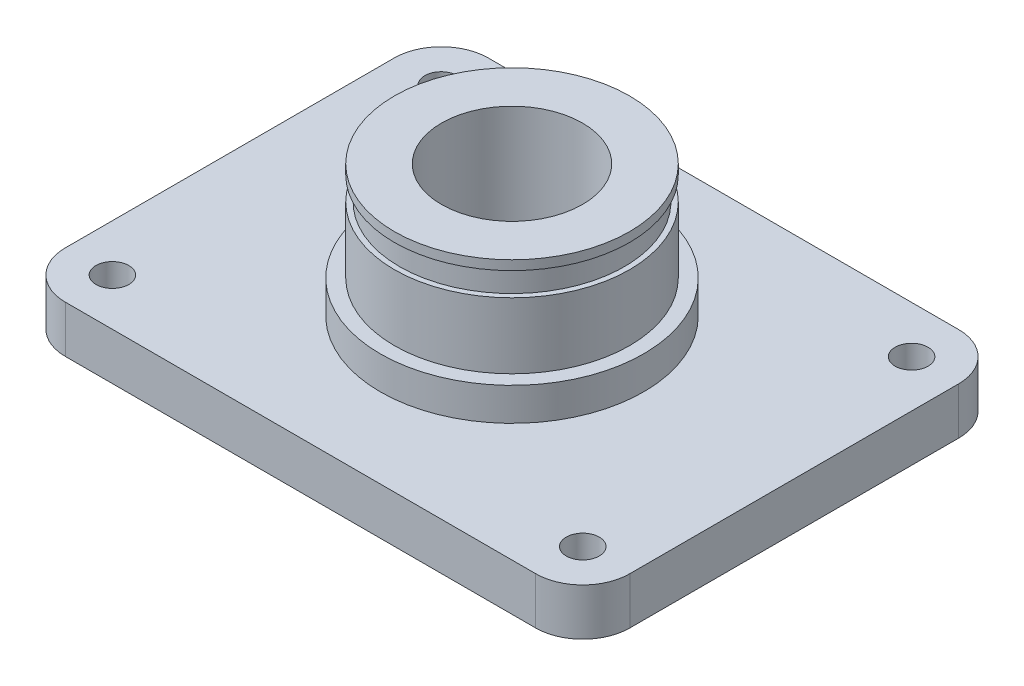
ISO-10303-21;
HEADER;
FILE_DESCRIPTION(('STEP AP214'),'2;1');
FILE_NAME('part.step','',(''),(''),'','','');
FILE_SCHEMA(('AUTOMOTIVE_DESIGN { 1 0 10303 214 1 1 1 1 }'));
ENDSEC;
DATA;
#1=APPLICATION_CONTEXT('core data for automotive mechanical design processes');
#2=APPLICATION_PROTOCOL_DEFINITION('international standard','automotive_design',2000,#1);
#3=PRODUCT_CONTEXT('',#1,'mechanical');
#4=PRODUCT('Part','Part','',(#3));
#5=PRODUCT_RELATED_PRODUCT_CATEGORY('part','',(#4));
#6=PRODUCT_DEFINITION_FORMATION('','',#4);
#7=PRODUCT_DEFINITION_CONTEXT('part definition',#1,'design');
#8=PRODUCT_DEFINITION('design','',#6,#7);
#9=PRODUCT_DEFINITION_SHAPE('','',#8);
#10=(LENGTH_UNIT() NAMED_UNIT(*) SI_UNIT(.MILLI.,.METRE.));
#11=(NAMED_UNIT(*) PLANE_ANGLE_UNIT() SI_UNIT($,.RADIAN.));
#12=(NAMED_UNIT(*) SI_UNIT($,.STERADIAN.) SOLID_ANGLE_UNIT());
#13=UNCERTAINTY_MEASURE_WITH_UNIT(LENGTH_MEASURE(1.E-05),#10,'distance_accuracy_value','');
#14=(GEOMETRIC_REPRESENTATION_CONTEXT(3) GLOBAL_UNCERTAINTY_ASSIGNED_CONTEXT((#13)) GLOBAL_UNIT_ASSIGNED_CONTEXT((#10,
#11,#12)) REPRESENTATION_CONTEXT('',''));
#15=CARTESIAN_POINT('',(0.,0.,0.));
#16=DIRECTION('',(0.,0.,1.));
#17=DIRECTION('',(1.,0.,0.));
#18=AXIS2_PLACEMENT_3D('',#15,#16,#17);
#19=CARTESIAN_POINT('',(0.,14.,0.));
#20=DIRECTION('',(0.,-1.,0.));
#21=DIRECTION('',(0.,0.,-1.));
#22=AXIS2_PLACEMENT_3D('',#19,#20,#21);
#23=CYLINDRICAL_SURFACE('',#22,12.5);
#24=CARTESIAN_POINT('',(0.,3.5,0.));
#25=DIRECTION('',(0.,1.,0.));
#26=DIRECTION('',(0.,0.,1.));
#27=AXIS2_PLACEMENT_3D('',#24,#25,#26);
#28=CIRCLE('',#27,12.5);
#29=CARTESIAN_POINT('',(0.,3.5,12.5));
#30=VERTEX_POINT('',#29);
#31=EDGE_CURVE('E160',#30,#30,#28,.T.);
#32=ORIENTED_EDGE('',*,*,#31,.T.);
#33=EDGE_LOOP('',(#32));
#34=FACE_BOUND('',#33,.T.);
#35=CARTESIAN_POINT('',(0.,10.5,0.));
#36=DIRECTION('',(0.,1.,0.));
#37=DIRECTION('',(0.,0.,1.));
#38=AXIS2_PLACEMENT_3D('',#35,#36,#37);
#39=CIRCLE('',#38,12.5);
#40=CARTESIAN_POINT('',(0.,10.5,12.5));
#41=VERTEX_POINT('',#40);
#42=EDGE_CURVE('E156',#41,#41,#39,.T.);
#43=ORIENTED_EDGE('',*,*,#42,.F.);
#44=EDGE_LOOP('',(#43));
#45=FACE_BOUND('',#44,.T.);
#46=ADVANCED_FACE('F33',(#34,#45),#23,.T.);
#47=CARTESIAN_POINT('',(0.,0.,0.));
#48=DIRECTION('',(0.,1.,0.));
#49=DIRECTION('',(0.,0.,1.));
#50=AXIS2_PLACEMENT_3D('',#47,#48,#49);
#51=PLANE('',#50);
#52=CARTESIAN_POINT('',(-25.,0.,17.4789664107582));
#53=DIRECTION('',(0.,1.,0.));
#54=DIRECTION('',(0.,0.,1.));
#55=AXIS2_PLACEMENT_3D('',#52,#53,#54);
#56=CIRCLE('',#55,1.75);
#57=CARTESIAN_POINT('',(-25.,0.,19.2289664107582));
#58=VERTEX_POINT('',#57);
#59=EDGE_CURVE('E369',#58,#58,#56,.T.);
#60=ORIENTED_EDGE('',*,*,#59,.F.);
#61=EDGE_LOOP('',(#60));
#62=FACE_BOUND('',#61,.T.);
#63=CARTESIAN_POINT('',(25.,0.,17.4789664107582));
#64=DIRECTION('',(0.,1.,0.));
#65=DIRECTION('',(0.,0.,1.));
#66=AXIS2_PLACEMENT_3D('',#63,#64,#65);
#67=CIRCLE('',#66,1.75);
#68=CARTESIAN_POINT('',(25.,0.,19.2289664107582));
#69=VERTEX_POINT('',#68);
#70=EDGE_CURVE('E370',#69,#69,#67,.T.);
#71=ORIENTED_EDGE('',*,*,#70,.F.);
#72=EDGE_LOOP('',(#71));
#73=FACE_BOUND('',#72,.T.);
#74=CARTESIAN_POINT('',(25.,0.,-17.4789664107582));
#75=DIRECTION('',(0.,1.,0.));
#76=DIRECTION('',(0.,0.,1.));
#77=AXIS2_PLACEMENT_3D('',#74,#75,#76);
#78=CIRCLE('',#77,1.75);
#79=CARTESIAN_POINT('',(25.,0.,-15.7289664107582));
#80=VERTEX_POINT('',#79);
#81=EDGE_CURVE('E372',#80,#80,#78,.T.);
#82=ORIENTED_EDGE('',*,*,#81,.F.);
#83=EDGE_LOOP('',(#82));
#84=FACE_BOUND('',#83,.T.);
#85=CARTESIAN_POINT('',(-25.,0.,-17.4789664107582));
#86=DIRECTION('',(0.,1.,0.));
#87=DIRECTION('',(0.,0.,1.));
#88=AXIS2_PLACEMENT_3D('',#85,#86,#87);
#89=CIRCLE('',#88,1.75);
#90=CARTESIAN_POINT('',(-25.,0.,-15.7289664107582));
#91=VERTEX_POINT('',#90);
#92=EDGE_CURVE('E165',#91,#91,#89,.T.);
#93=ORIENTED_EDGE('',*,*,#92,.F.);
#94=EDGE_LOOP('',(#93));
#95=FACE_BOUND('',#94,.T.);
#96=DIRECTION('',(0.,0.,1.));
#97=VECTOR('',#96,1.);
#98=CARTESIAN_POINT('',(30.,0.,-22.4789664107582));
#99=LINE('',#98,#97);
#100=CARTESIAN_POINT('',(30.,0.,-17.4789664107582));
#101=VERTEX_POINT('',#100);
#102=CARTESIAN_POINT('',(30.,0.,17.4789664107582));
#103=VERTEX_POINT('',#102);
#104=EDGE_CURVE('E197',#101,#103,#99,.T.);
#105=ORIENTED_EDGE('',*,*,#104,.F.);
#106=CARTESIAN_POINT('',(25.,0.,-17.4789664107582));
#107=DIRECTION('',(0.,1.,0.));
#108=DIRECTION('',(0.,0.,1.));
#109=AXIS2_PLACEMENT_3D('',#106,#107,#108);
#110=CIRCLE('',#109,5.);
#111=CARTESIAN_POINT('',(25.,0.,-22.4789664107582));
#112=VERTEX_POINT('',#111);
#113=EDGE_CURVE('E146',#101,#112,#110,.T.);
#114=ORIENTED_EDGE('',*,*,#113,.T.);
#115=DIRECTION('',(1.,0.,0.));
#116=VECTOR('',#115,1.);
#117=CARTESIAN_POINT('',(-30.,0.,-22.4789664107582));
#118=LINE('',#117,#116);
#119=CARTESIAN_POINT('',(-25.,0.,-22.4789664107582));
#120=VERTEX_POINT('',#119);
#121=EDGE_CURVE('E211',#120,#112,#118,.T.);
#122=ORIENTED_EDGE('',*,*,#121,.F.);
#123=CARTESIAN_POINT('',(-25.,0.,-17.4789664107582));
#124=DIRECTION('',(0.,1.,0.));
#125=DIRECTION('',(0.,0.,1.));
#126=AXIS2_PLACEMENT_3D('',#123,#124,#125);
#127=CIRCLE('',#126,5.);
#128=CARTESIAN_POINT('',(-30.,0.,-17.4789664107582));
#129=VERTEX_POINT('',#128);
#130=EDGE_CURVE('E126',#120,#129,#127,.T.);
#131=ORIENTED_EDGE('',*,*,#130,.T.);
#132=DIRECTION('',(0.,0.,-1.));
#133=VECTOR('',#132,1.);
#134=CARTESIAN_POINT('',(-30.,0.,-22.4789664107582));
#135=LINE('',#134,#133);
#136=CARTESIAN_POINT('',(-30.,0.,17.4789664107582));
#137=VERTEX_POINT('',#136);
#138=EDGE_CURVE('E208',#137,#129,#135,.T.);
#139=ORIENTED_EDGE('',*,*,#138,.F.);
#140=CARTESIAN_POINT('',(-25.,0.,17.4789664107582));
#141=DIRECTION('',(0.,1.,0.));
#142=DIRECTION('',(0.,0.,1.));
#143=AXIS2_PLACEMENT_3D('',#140,#141,#142);
#144=CIRCLE('',#143,5.);
#145=CARTESIAN_POINT('',(-25.,0.,22.4789664107582));
#146=VERTEX_POINT('',#145);
#147=EDGE_CURVE('E50',#137,#146,#144,.T.);
#148=ORIENTED_EDGE('',*,*,#147,.T.);
#149=DIRECTION('',(-1.,0.,0.));
#150=VECTOR('',#149,1.);
#151=CARTESIAN_POINT('',(-30.,0.,22.4789664107582));
#152=LINE('',#151,#150);
#153=CARTESIAN_POINT('',(25.,0.,22.4789664107582));
#154=VERTEX_POINT('',#153);
#155=EDGE_CURVE('E206',#154,#146,#152,.T.);
#156=ORIENTED_EDGE('',*,*,#155,.F.);
#157=CARTESIAN_POINT('',(25.,0.,17.4789664107582));
#158=DIRECTION('',(0.,1.,0.));
#159=DIRECTION('',(0.,0.,1.));
#160=AXIS2_PLACEMENT_3D('',#157,#158,#159);
#161=CIRCLE('',#160,5.);
#162=EDGE_CURVE('E144',#154,#103,#161,.T.);
#163=ORIENTED_EDGE('',*,*,#162,.T.);
#164=EDGE_LOOP('',(#105,#114,#122,#131,#139,#148,#156,#163));
#165=FACE_BOUND('',#164,.T.);
#166=CARTESIAN_POINT('',(0.,0.,0.));
#167=DIRECTION('',(0.,1.,0.));
#168=DIRECTION('',(0.,0.,1.));
#169=AXIS2_PLACEMENT_3D('',#166,#167,#168);
#170=CIRCLE('',#169,14.);
#171=CARTESIAN_POINT('',(0.,0.,14.));
#172=VERTEX_POINT('',#171);
#173=EDGE_CURVE('E189',#172,#172,#170,.T.);
#174=ORIENTED_EDGE('',*,*,#173,.F.);
#175=EDGE_LOOP('',(#174));
#176=FACE_BOUND('',#175,.T.);
#177=ADVANCED_FACE('F217',(#62,#73,#84,#95,#165,#176),#51,.T.);
#178=CARTESIAN_POINT('',(0.,14.,0.));
#179=DIRECTION('',(0.,1.,0.));
#180=DIRECTION('',(0.,0.,1.));
#181=AXIS2_PLACEMENT_3D('',#178,#179,#180);
#182=PLANE('',#181);
#183=CARTESIAN_POINT('',(0.,14.,0.));
#184=DIRECTION('',(0.,1.,0.));
#185=DIRECTION('',(0.,0.,1.));
#186=AXIS2_PLACEMENT_3D('',#183,#184,#185);
#187=CIRCLE('',#186,12.5);
#188=CARTESIAN_POINT('',(0.,14.,12.5));
#189=VERTEX_POINT('',#188);
#190=EDGE_CURVE('E122',#189,#189,#187,.T.);
#191=ORIENTED_EDGE('',*,*,#190,.T.);
#192=EDGE_LOOP('',(#191));
#193=FACE_BOUND('',#192,.T.);
#194=CARTESIAN_POINT('',(0.,14.,0.));
#195=DIRECTION('',(0.,1.,0.));
#196=DIRECTION('',(0.,0.,1.));
#197=AXIS2_PLACEMENT_3D('',#194,#195,#196);
#198=CIRCLE('',#197,7.49999999999999);
#199=CARTESIAN_POINT('',(0.,14.,7.49999999999999));
#200=VERTEX_POINT('',#199);
#201=EDGE_CURVE('E172',#200,#200,#198,.T.);
#202=ORIENTED_EDGE('',*,*,#201,.F.);
#203=EDGE_LOOP('',(#202));
#204=FACE_BOUND('',#203,.T.);
#205=ADVANCED_FACE('F251',(#193,#204),#182,.T.);
#206=CARTESIAN_POINT('',(0.,13.,0.));
#207=DIRECTION('',(0.,1.,0.));
#208=DIRECTION('',(0.,0.,1.));
#209=AXIS2_PLACEMENT_3D('',#206,#207,#208);
#210=CIRCLE('',#209,12.5);
#211=CARTESIAN_POINT('',(0.,13.,12.5));
#212=VERTEX_POINT('',#211);
#213=EDGE_CURVE('E153',#212,#212,#210,.T.);
#214=ORIENTED_EDGE('',*,*,#213,.T.);
#215=EDGE_LOOP('',(#214));
#216=FACE_BOUND('',#215,.T.);
#217=ORIENTED_EDGE('',*,*,#190,.F.);
#218=EDGE_LOOP('',(#217));
#219=FACE_BOUND('',#218,.T.);
#220=ADVANCED_FACE('F245',(#216,#219),#23,.T.);
#221=CARTESIAN_POINT('',(-30.,74.9747672459474,-22.4789664107582));
#222=DIRECTION('',(-1.,0.,0.));
#223=DIRECTION('',(0.,0.,1.));
#224=AXIS2_PLACEMENT_3D('',#221,#222,#223);
#225=PLANE('',#224);
#226=ORIENTED_EDGE('',*,*,#138,.T.);
#227=DIRECTION('',(0.,-1.,0.));
#228=VECTOR('',#227,1.);
#229=CARTESIAN_POINT('',(-30.,74.9747672459474,-17.4789664107582));
#230=LINE('',#229,#228);
#231=CARTESIAN_POINT('',(-30.,-5.,-17.4789664107582));
#232=VERTEX_POINT('',#231);
#233=EDGE_CURVE('E11',#129,#232,#230,.T.);
#234=ORIENTED_EDGE('',*,*,#233,.T.);
#235=DIRECTION('',(0.,0.,-1.));
#236=VECTOR('',#235,1.);
#237=CARTESIAN_POINT('',(-30.,-5.,-22.4789664107582));
#238=LINE('',#237,#236);
#239=CARTESIAN_POINT('',(-30.,-5.,17.4789664107582));
#240=VERTEX_POINT('',#239);
#241=EDGE_CURVE('E107',#240,#232,#238,.T.);
#242=ORIENTED_EDGE('',*,*,#241,.F.);
#243=DIRECTION('',(0.,-1.,0.));
#244=VECTOR('',#243,1.);
#245=CARTESIAN_POINT('',(-30.,74.9747672459474,17.4789664107582));
#246=LINE('',#245,#244);
#247=EDGE_CURVE('E42',#240,#137,#246,.F.);
#248=ORIENTED_EDGE('',*,*,#247,.T.);
#249=EDGE_LOOP('',(#226,#234,#242,#248));
#250=FACE_BOUND('',#249,.T.);
#251=ADVANCED_FACE('F214',(#250),#225,.T.);
#252=CARTESIAN_POINT('',(30.,74.9747672459474,-22.4789664107582));
#253=DIRECTION('',(1.,0.,0.));
#254=DIRECTION('',(0.,0.,-1.));
#255=AXIS2_PLACEMENT_3D('',#252,#253,#254);
#256=PLANE('',#255);
#257=DIRECTION('',(0.,0.,1.));
#258=VECTOR('',#257,1.);
#259=CARTESIAN_POINT('',(30.,-5.,-22.4789664107582));
#260=LINE('',#259,#258);
#261=CARTESIAN_POINT('',(30.,-5.,-17.4789664107582));
#262=VERTEX_POINT('',#261);
#263=CARTESIAN_POINT('',(30.,-5.,17.4789664107582));
#264=VERTEX_POINT('',#263);
#265=EDGE_CURVE('E203',#262,#264,#260,.T.);
#266=ORIENTED_EDGE('',*,*,#265,.F.);
#267=DIRECTION('',(0.,-1.,0.));
#268=VECTOR('',#267,1.);
#269=CARTESIAN_POINT('',(30.,74.9747672459474,-17.4789664107582));
#270=LINE('',#269,#268);
#271=EDGE_CURVE('E140',#262,#101,#270,.F.);
#272=ORIENTED_EDGE('',*,*,#271,.T.);
#273=ORIENTED_EDGE('',*,*,#104,.T.);
#274=DIRECTION('',(0.,-1.,0.));
#275=VECTOR('',#274,1.);
#276=CARTESIAN_POINT('',(30.,74.9747672459474,17.4789664107582));
#277=LINE('',#276,#275);
#278=EDGE_CURVE('E137',#103,#264,#277,.T.);
#279=ORIENTED_EDGE('',*,*,#278,.T.);
#280=EDGE_LOOP('',(#266,#272,#273,#279));
#281=FACE_BOUND('',#280,.T.);
#282=ADVANCED_FACE('F228',(#281),#256,.T.);
#283=CARTESIAN_POINT('',(-30.,74.9747672459474,-22.4789664107582));
#284=DIRECTION('',(0.,0.,-1.));
#285=DIRECTION('',(-1.,0.,0.));
#286=AXIS2_PLACEMENT_3D('',#283,#284,#285);
#287=PLANE('',#286);
#288=ORIENTED_EDGE('',*,*,#121,.T.);
#289=DIRECTION('',(0.,-1.,0.));
#290=VECTOR('',#289,1.);
#291=CARTESIAN_POINT('',(25.,74.9747672459474,-22.4789664107582));
#292=LINE('',#291,#290);
#293=CARTESIAN_POINT('',(25.,-5.,-22.4789664107582));
#294=VERTEX_POINT('',#293);
#295=EDGE_CURVE('E121',#112,#294,#292,.T.);
#296=ORIENTED_EDGE('',*,*,#295,.T.);
#297=DIRECTION('',(1.,0.,0.));
#298=VECTOR('',#297,1.);
#299=CARTESIAN_POINT('',(-30.,-5.,-22.4789664107582));
#300=LINE('',#299,#298);
#301=CARTESIAN_POINT('',(-25.,-5.,-22.4789664107582));
#302=VERTEX_POINT('',#301);
#303=EDGE_CURVE('E105',#302,#294,#300,.T.);
#304=ORIENTED_EDGE('',*,*,#303,.F.);
#305=DIRECTION('',(0.,-1.,0.));
#306=VECTOR('',#305,1.);
#307=CARTESIAN_POINT('',(-25.,74.9747672459474,-22.4789664107582));
#308=LINE('',#307,#306);
#309=EDGE_CURVE('E118',#302,#120,#308,.F.);
#310=ORIENTED_EDGE('',*,*,#309,.T.);
#311=EDGE_LOOP('',(#288,#296,#304,#310));
#312=FACE_BOUND('',#311,.T.);
#313=ADVANCED_FACE('F117',(#312),#287,.T.);
#314=CARTESIAN_POINT('',(-30.,74.9747672459474,22.4789664107582));
#315=DIRECTION('',(0.,0.,1.));
#316=DIRECTION('',(1.,0.,0.));
#317=AXIS2_PLACEMENT_3D('',#314,#315,#316);
#318=PLANE('',#317);
#319=DIRECTION('',(-1.,0.,0.));
#320=VECTOR('',#319,1.);
#321=CARTESIAN_POINT('',(-30.,-5.,22.4789664107582));
#322=LINE('',#321,#320);
#323=CARTESIAN_POINT('',(25.,-5.,22.4789664107582));
#324=VERTEX_POINT('',#323);
#325=CARTESIAN_POINT('',(-25.,-5.,22.4789664107582));
#326=VERTEX_POINT('',#325);
#327=EDGE_CURVE('E200',#324,#326,#322,.T.);
#328=ORIENTED_EDGE('',*,*,#327,.F.);
#329=DIRECTION('',(0.,-1.,0.));
#330=VECTOR('',#329,1.);
#331=CARTESIAN_POINT('',(25.,74.9747672459474,22.4789664107582));
#332=LINE('',#331,#330);
#333=EDGE_CURVE('E57',#324,#154,#332,.F.);
#334=ORIENTED_EDGE('',*,*,#333,.T.);
#335=ORIENTED_EDGE('',*,*,#155,.T.);
#336=DIRECTION('',(0.,-1.,0.));
#337=VECTOR('',#336,1.);
#338=CARTESIAN_POINT('',(-25.,74.9747672459474,22.4789664107582));
#339=LINE('',#338,#337);
#340=EDGE_CURVE('E148',#146,#326,#339,.T.);
#341=ORIENTED_EDGE('',*,*,#340,.T.);
#342=EDGE_LOOP('',(#328,#334,#335,#341));
#343=FACE_BOUND('',#342,.T.);
#344=ADVANCED_FACE('F221',(#343),#318,.T.);
#345=CARTESIAN_POINT('',(0.,-5.,0.));
#346=DIRECTION('',(0.,1.,0.));
#347=DIRECTION('',(0.,0.,1.));
#348=AXIS2_PLACEMENT_3D('',#345,#346,#347);
#349=PLANE('',#348);
#350=CARTESIAN_POINT('',(-25.,-5.,17.4789664107582));
#351=DIRECTION('',(0.,1.,0.));
#352=DIRECTION('',(0.,0.,1.));
#353=AXIS2_PLACEMENT_3D('',#350,#351,#352);
#354=CIRCLE('',#353,1.75);
#355=CARTESIAN_POINT('',(-25.,-5.,19.2289664107582));
#356=VERTEX_POINT('',#355);
#357=EDGE_CURVE('E37',#356,#356,#354,.T.);
#358=ORIENTED_EDGE('',*,*,#357,.T.);
#359=EDGE_LOOP('',(#358));
#360=FACE_BOUND('',#359,.T.);
#361=CARTESIAN_POINT('',(25.,-5.,17.4789664107582));
#362=DIRECTION('',(0.,1.,0.));
#363=DIRECTION('',(0.,0.,1.));
#364=AXIS2_PLACEMENT_3D('',#361,#362,#363);
#365=CIRCLE('',#364,1.75);
#366=CARTESIAN_POINT('',(25.,-5.,19.2289664107582));
#367=VERTEX_POINT('',#366);
#368=EDGE_CURVE('E167',#367,#367,#365,.T.);
#369=ORIENTED_EDGE('',*,*,#368,.T.);
#370=EDGE_LOOP('',(#369));
#371=FACE_BOUND('',#370,.T.);
#372=CARTESIAN_POINT('',(25.,-5.,-17.4789664107582));
#373=DIRECTION('',(0.,1.,0.));
#374=DIRECTION('',(0.,0.,1.));
#375=AXIS2_PLACEMENT_3D('',#372,#373,#374);
#376=CIRCLE('',#375,1.75);
#377=CARTESIAN_POINT('',(25.,-5.,-15.7289664107582));
#378=VERTEX_POINT('',#377);
#379=EDGE_CURVE('E164',#378,#378,#376,.T.);
#380=ORIENTED_EDGE('',*,*,#379,.T.);
#381=EDGE_LOOP('',(#380));
#382=FACE_BOUND('',#381,.T.);
#383=CARTESIAN_POINT('',(-25.,-5.,-17.4789664107582));
#384=DIRECTION('',(0.,1.,0.));
#385=DIRECTION('',(0.,0.,1.));
#386=AXIS2_PLACEMENT_3D('',#383,#384,#385);
#387=CIRCLE('',#386,1.75);
#388=CARTESIAN_POINT('',(-25.,-5.,-15.7289664107582));
#389=VERTEX_POINT('',#388);
#390=EDGE_CURVE('E161',#389,#389,#387,.T.);
#391=ORIENTED_EDGE('',*,*,#390,.T.);
#392=EDGE_LOOP('',(#391));
#393=FACE_BOUND('',#392,.T.);
#394=CARTESIAN_POINT('',(0.,-5.,0.));
#395=DIRECTION('',(0.,-1.,0.));
#396=DIRECTION('',(0.,0.,-1.));
#397=AXIS2_PLACEMENT_3D('',#394,#395,#396);
#398=CIRCLE('',#397,7.5);
#399=CARTESIAN_POINT('',(0.,-5.,-7.49999999999999));
#400=VERTEX_POINT('',#399);
#401=EDGE_CURVE('E193',#400,#400,#398,.T.);
#402=ORIENTED_EDGE('',*,*,#401,.F.);
#403=EDGE_LOOP('',(#402));
#404=FACE_BOUND('',#403,.T.);
#405=ORIENTED_EDGE('',*,*,#303,.T.);
#406=CARTESIAN_POINT('',(25.,-5.,-17.4789664107582));
#407=DIRECTION('',(0.,1.,0.));
#408=DIRECTION('',(0.,0.,1.));
#409=AXIS2_PLACEMENT_3D('',#406,#407,#408);
#410=CIRCLE('',#409,5.);
#411=EDGE_CURVE('E135',#294,#262,#410,.F.);
#412=ORIENTED_EDGE('',*,*,#411,.T.);
#413=ORIENTED_EDGE('',*,*,#265,.T.);
#414=CARTESIAN_POINT('',(25.,-5.,17.4789664107582));
#415=DIRECTION('',(0.,1.,0.));
#416=DIRECTION('',(0.,0.,1.));
#417=AXIS2_PLACEMENT_3D('',#414,#415,#416);
#418=CIRCLE('',#417,5.);
#419=EDGE_CURVE('E111',#264,#324,#418,.F.);
#420=ORIENTED_EDGE('',*,*,#419,.T.);
#421=ORIENTED_EDGE('',*,*,#327,.T.);
#422=CARTESIAN_POINT('',(-25.,-5.,17.4789664107582));
#423=DIRECTION('',(0.,1.,0.));
#424=DIRECTION('',(0.,0.,1.));
#425=AXIS2_PLACEMENT_3D('',#422,#423,#424);
#426=CIRCLE('',#425,5.);
#427=EDGE_CURVE('E112',#326,#240,#426,.F.);
#428=ORIENTED_EDGE('',*,*,#427,.T.);
#429=ORIENTED_EDGE('',*,*,#241,.T.);
#430=CARTESIAN_POINT('',(-25.,-5.,-17.4789664107582));
#431=DIRECTION('',(0.,1.,0.));
#432=DIRECTION('',(0.,0.,1.));
#433=AXIS2_PLACEMENT_3D('',#430,#431,#432);
#434=CIRCLE('',#433,5.);
#435=EDGE_CURVE('E102',#232,#302,#434,.F.);
#436=ORIENTED_EDGE('',*,*,#435,.T.);
#437=EDGE_LOOP('',(#405,#412,#413,#420,#421,#428,#429,#436));
#438=FACE_BOUND('',#437,.T.);
#439=ADVANCED_FACE('F104',(#360,#371,#382,#393,#404,#438),#349,.F.);
#440=CARTESIAN_POINT('',(25.,74.9747672459474,-17.4789664107582));
#441=DIRECTION('',(0.,-1.,0.));
#442=DIRECTION('',(0.,0.,-1.));
#443=AXIS2_PLACEMENT_3D('',#440,#441,#442);
#444=CYLINDRICAL_SURFACE('',#443,5.);
#445=ORIENTED_EDGE('',*,*,#113,.F.);
#446=ORIENTED_EDGE('',*,*,#271,.F.);
#447=ORIENTED_EDGE('',*,*,#411,.F.);
#448=ORIENTED_EDGE('',*,*,#295,.F.);
#449=EDGE_LOOP('',(#445,#446,#447,#448));
#450=FACE_BOUND('',#449,.T.);
#451=ADVANCED_FACE('F232',(#450),#444,.T.);
#452=CARTESIAN_POINT('',(25.,74.9747672459474,17.4789664107582));
#453=DIRECTION('',(0.,-1.,0.));
#454=DIRECTION('',(0.,0.,-1.));
#455=AXIS2_PLACEMENT_3D('',#452,#453,#454);
#456=CYLINDRICAL_SURFACE('',#455,5.);
#457=ORIENTED_EDGE('',*,*,#162,.F.);
#458=ORIENTED_EDGE('',*,*,#333,.F.);
#459=ORIENTED_EDGE('',*,*,#419,.F.);
#460=ORIENTED_EDGE('',*,*,#278,.F.);
#461=EDGE_LOOP('',(#457,#458,#459,#460));
#462=FACE_BOUND('',#461,.T.);
#463=ADVANCED_FACE('F226',(#462),#456,.T.);
#464=CARTESIAN_POINT('',(-25.,74.9747672459474,-17.4789664107582));
#465=DIRECTION('',(0.,-1.,0.));
#466=DIRECTION('',(0.,0.,-1.));
#467=AXIS2_PLACEMENT_3D('',#464,#465,#466);
#468=CYLINDRICAL_SURFACE('',#467,5.);
#469=ORIENTED_EDGE('',*,*,#130,.F.);
#470=ORIENTED_EDGE('',*,*,#309,.F.);
#471=ORIENTED_EDGE('',*,*,#435,.F.);
#472=ORIENTED_EDGE('',*,*,#233,.F.);
#473=EDGE_LOOP('',(#469,#470,#471,#472));
#474=FACE_BOUND('',#473,.T.);
#475=ADVANCED_FACE('F125',(#474),#468,.T.);
#476=CARTESIAN_POINT('',(-25.,74.9747672459474,17.4789664107582));
#477=DIRECTION('',(0.,-1.,0.));
#478=DIRECTION('',(0.,0.,-1.));
#479=AXIS2_PLACEMENT_3D('',#476,#477,#478);
#480=CYLINDRICAL_SURFACE('',#479,5.);
#481=ORIENTED_EDGE('',*,*,#147,.F.);
#482=ORIENTED_EDGE('',*,*,#247,.F.);
#483=ORIENTED_EDGE('',*,*,#427,.F.);
#484=ORIENTED_EDGE('',*,*,#340,.F.);
#485=EDGE_LOOP('',(#481,#482,#483,#484));
#486=FACE_BOUND('',#485,.T.);
#487=ADVANCED_FACE('F35',(#486),#480,.T.);
#488=CARTESIAN_POINT('',(0.,5.43572121597424,0.));
#489=DIRECTION('',(0.,-1.,0.));
#490=DIRECTION('',(0.,0.,-1.));
#491=AXIS2_PLACEMENT_3D('',#488,#489,#490);
#492=CYLINDRICAL_SURFACE('',#491,7.5);
#493=ORIENTED_EDGE('',*,*,#401,.T.);
#494=EDGE_LOOP('',(#493));
#495=FACE_BOUND('',#494,.T.);
#496=ORIENTED_EDGE('',*,*,#201,.T.);
#497=EDGE_LOOP('',(#496));
#498=FACE_BOUND('',#497,.T.);
#499=ADVANCED_FACE('F289',(#495,#498),#492,.F.);
#500=CARTESIAN_POINT('',(0.,3.5,0.));
#501=DIRECTION('',(0.,1.,0.));
#502=DIRECTION('',(0.,0.,1.));
#503=AXIS2_PLACEMENT_3D('',#500,#501,#502);
#504=PLANE('',#503);
#505=CARTESIAN_POINT('',(0.,3.5,0.));
#506=DIRECTION('',(0.,1.,0.));
#507=DIRECTION('',(0.,0.,1.));
#508=AXIS2_PLACEMENT_3D('',#505,#506,#507);
#509=CIRCLE('',#508,14.);
#510=CARTESIAN_POINT('',(0.,3.5,14.));
#511=VERTEX_POINT('',#510);
#512=EDGE_CURVE('E190',#511,#511,#509,.T.);
#513=ORIENTED_EDGE('',*,*,#512,.T.);
#514=EDGE_LOOP('',(#513));
#515=FACE_BOUND('',#514,.T.);
#516=ORIENTED_EDGE('',*,*,#31,.F.);
#517=EDGE_LOOP('',(#516));
#518=FACE_BOUND('',#517,.T.);
#519=ADVANCED_FACE('F286',(#515,#518),#504,.T.);
#520=CARTESIAN_POINT('',(0.,3.5,0.));
#521=DIRECTION('',(0.,-1.,0.));
#522=DIRECTION('',(0.,0.,-1.));
#523=AXIS2_PLACEMENT_3D('',#520,#521,#522);
#524=CYLINDRICAL_SURFACE('',#523,14.);
#525=ORIENTED_EDGE('',*,*,#512,.F.);
#526=EDGE_LOOP('',(#525));
#527=FACE_BOUND('',#526,.T.);
#528=ORIENTED_EDGE('',*,*,#173,.T.);
#529=EDGE_LOOP('',(#528));
#530=FACE_BOUND('',#529,.T.);
#531=ADVANCED_FACE('F282',(#527,#530),#524,.T.);
#532=CARTESIAN_POINT('',(0.,10.5,0.));
#533=DIRECTION('',(0.,1.,0.));
#534=DIRECTION('',(0.,0.,1.));
#535=AXIS2_PLACEMENT_3D('',#532,#533,#534);
#536=PLANE('',#535);
#537=CARTESIAN_POINT('',(0.,10.5,0.));
#538=DIRECTION('',(0.,1.,0.));
#539=DIRECTION('',(0.,0.,1.));
#540=AXIS2_PLACEMENT_3D('',#537,#538,#539);
#541=CIRCLE('',#540,11.95);
#542=CARTESIAN_POINT('',(0.,10.5,11.95));
#543=VERTEX_POINT('',#542);
#544=EDGE_CURVE('E157',#543,#543,#541,.T.);
#545=ORIENTED_EDGE('',*,*,#544,.F.);
#546=EDGE_LOOP('',(#545));
#547=FACE_BOUND('',#546,.T.);
#548=ORIENTED_EDGE('',*,*,#42,.T.);
#549=EDGE_LOOP('',(#548));
#550=FACE_BOUND('',#549,.T.);
#551=ADVANCED_FACE('F272',(#547,#550),#536,.T.);
#552=CARTESIAN_POINT('',(0.,13.,0.));
#553=DIRECTION('',(0.,1.,0.));
#554=DIRECTION('',(0.,0.,1.));
#555=AXIS2_PLACEMENT_3D('',#552,#553,#554);
#556=PLANE('',#555);
#557=CARTESIAN_POINT('',(0.,13.,0.));
#558=DIRECTION('',(0.,1.,0.));
#559=DIRECTION('',(0.,0.,1.));
#560=AXIS2_PLACEMENT_3D('',#557,#558,#559);
#561=CIRCLE('',#560,11.95);
#562=CARTESIAN_POINT('',(0.,13.,11.95));
#563=VERTEX_POINT('',#562);
#564=EDGE_CURVE('E176',#563,#563,#561,.T.);
#565=ORIENTED_EDGE('',*,*,#564,.T.);
#566=EDGE_LOOP('',(#565));
#567=FACE_BOUND('',#566,.T.);
#568=ORIENTED_EDGE('',*,*,#213,.F.);
#569=EDGE_LOOP('',(#568));
#570=FACE_BOUND('',#569,.T.);
#571=ADVANCED_FACE('F269',(#567,#570),#556,.F.);
#572=CARTESIAN_POINT('',(0.,10.5,0.));
#573=DIRECTION('',(0.,1.,0.));
#574=DIRECTION('',(0.,0.,1.));
#575=AXIS2_PLACEMENT_3D('',#572,#573,#574);
#576=CYLINDRICAL_SURFACE('',#575,11.95);
#577=ORIENTED_EDGE('',*,*,#544,.T.);
#578=EDGE_LOOP('',(#577));
#579=FACE_BOUND('',#578,.T.);
#580=ORIENTED_EDGE('',*,*,#564,.F.);
#581=EDGE_LOOP('',(#580));
#582=FACE_BOUND('',#581,.T.);
#583=ADVANCED_FACE('F271',(#579,#582),#576,.T.);
#584=CARTESIAN_POINT('',(-25.,-6.2,-17.4789664107582));
#585=DIRECTION('',(0.,1.,0.));
#586=DIRECTION('',(0.,0.,1.));
#587=AXIS2_PLACEMENT_3D('',#584,#585,#586);
#588=CYLINDRICAL_SURFACE('',#587,1.75);
#589=CARTESIAN_POINT('',(-25.,0.,-15.7289664107582));
#590=CARTESIAN_POINT('',(-25.,-0.0520833333333334,-15.7289664107582));
#591=CARTESIAN_POINT('',(-25.,-0.104166666666667,-15.7289664107582));
#592=CARTESIAN_POINT('',(-25.,-0.208333333333334,-15.7289664107582));
#593=CARTESIAN_POINT('',(-25.,-0.260416666666667,-15.7289664107582));
#594=CARTESIAN_POINT('',(-25.,-0.364583333333334,-15.7289664107582));
#595=CARTESIAN_POINT('',(-25.,-0.416666666666667,-15.7289664107582));
#596=CARTESIAN_POINT('',(-25.,-0.520833333333334,-15.7289664107582));
#597=CARTESIAN_POINT('',(-25.,-0.572916666666667,-15.7289664107582));
#598=CARTESIAN_POINT('',(-25.,-0.677083333333334,-15.7289664107582));
#599=CARTESIAN_POINT('',(-25.,-0.729166666666667,-15.7289664107582));
#600=CARTESIAN_POINT('',(-25.,-0.833333333333333,-15.7289664107582));
#601=CARTESIAN_POINT('',(-25.,-0.885416666666667,-15.7289664107582));
#602=CARTESIAN_POINT('',(-25.,-0.989583333333333,-15.7289664107582));
#603=CARTESIAN_POINT('',(-25.,-1.04166666666667,-15.7289664107582));
#604=CARTESIAN_POINT('',(-25.,-1.14583333333333,-15.7289664107582));
#605=CARTESIAN_POINT('',(-25.,-1.19791666666667,-15.7289664107582));
#606=CARTESIAN_POINT('',(-25.,-1.30208333333333,-15.7289664107582));
#607=CARTESIAN_POINT('',(-25.,-1.35416666666667,-15.7289664107582));
#608=CARTESIAN_POINT('',(-25.,-1.45833333333333,-15.7289664107582));
#609=CARTESIAN_POINT('',(-25.,-1.51041666666667,-15.7289664107582));
#610=CARTESIAN_POINT('',(-25.,-1.61458333333333,-15.7289664107582));
#611=CARTESIAN_POINT('',(-25.,-1.66666666666667,-15.7289664107582));
#612=CARTESIAN_POINT('',(-25.,-1.77083333333333,-15.7289664107582));
#613=CARTESIAN_POINT('',(-25.,-1.82291666666667,-15.7289664107582));
#614=CARTESIAN_POINT('',(-25.,-1.92708333333333,-15.7289664107582));
#615=CARTESIAN_POINT('',(-25.,-1.97916666666667,-15.7289664107582));
#616=CARTESIAN_POINT('',(-25.,-2.08333333333333,-15.7289664107582));
#617=CARTESIAN_POINT('',(-25.,-2.13541666666667,-15.7289664107582));
#618=CARTESIAN_POINT('',(-25.,-2.23958333333333,-15.7289664107582));
#619=CARTESIAN_POINT('',(-25.,-2.29166666666667,-15.7289664107582));
#620=CARTESIAN_POINT('',(-25.,-2.39583333333333,-15.7289664107582));
#621=CARTESIAN_POINT('',(-25.,-2.44791666666667,-15.7289664107582));
#622=CARTESIAN_POINT('',(-25.,-2.55208333333333,-15.7289664107582));
#623=CARTESIAN_POINT('',(-25.,-2.60416666666667,-15.7289664107582));
#624=CARTESIAN_POINT('',(-25.,-2.70833333333333,-15.7289664107582));
#625=CARTESIAN_POINT('',(-25.,-2.76041666666667,-15.7289664107582));
#626=CARTESIAN_POINT('',(-25.,-2.86458333333333,-15.7289664107582));
#627=CARTESIAN_POINT('',(-25.,-2.91666666666667,-15.7289664107582));
#628=CARTESIAN_POINT('',(-25.,-3.02083333333333,-15.7289664107582));
#629=CARTESIAN_POINT('',(-25.,-3.07291666666667,-15.7289664107582));
#630=CARTESIAN_POINT('',(-25.,-3.17708333333333,-15.7289664107582));
#631=CARTESIAN_POINT('',(-25.,-3.22916666666667,-15.7289664107582));
#632=CARTESIAN_POINT('',(-25.,-3.33333333333333,-15.7289664107582));
#633=CARTESIAN_POINT('',(-25.,-3.38541666666667,-15.7289664107582));
#634=CARTESIAN_POINT('',(-25.,-3.48958333333333,-15.7289664107582));
#635=CARTESIAN_POINT('',(-25.,-3.54166666666667,-15.7289664107582));
#636=CARTESIAN_POINT('',(-25.,-3.64583333333333,-15.7289664107582));
#637=CARTESIAN_POINT('',(-25.,-3.69791666666667,-15.7289664107582));
#638=CARTESIAN_POINT('',(-25.,-3.80208333333333,-15.7289664107582));
#639=CARTESIAN_POINT('',(-25.,-3.85416666666667,-15.7289664107582));
#640=CARTESIAN_POINT('',(-25.,-3.95833333333333,-15.7289664107582));
#641=CARTESIAN_POINT('',(-25.,-4.01041666666667,-15.7289664107582));
#642=CARTESIAN_POINT('',(-25.,-4.11458333333333,-15.7289664107582));
#643=CARTESIAN_POINT('',(-25.,-4.16666666666667,-15.7289664107582));
#644=CARTESIAN_POINT('',(-25.,-4.27083333333333,-15.7289664107582));
#645=CARTESIAN_POINT('',(-25.,-4.32291666666667,-15.7289664107582));
#646=CARTESIAN_POINT('',(-25.,-4.42708333333333,-15.7289664107582));
#647=CARTESIAN_POINT('',(-25.,-4.47916666666667,-15.7289664107582));
#648=CARTESIAN_POINT('',(-25.,-4.58333333333333,-15.7289664107582));
#649=CARTESIAN_POINT('',(-25.,-4.63541666666667,-15.7289664107582));
#650=CARTESIAN_POINT('',(-25.,-4.73958333333333,-15.7289664107582));
#651=CARTESIAN_POINT('',(-25.,-4.79166666666667,-15.7289664107582));
#652=CARTESIAN_POINT('',(-25.,-4.89583333333333,-15.7289664107582));
#653=CARTESIAN_POINT('',(-25.,-4.94791666666667,-15.7289664107582));
#654=CARTESIAN_POINT('',(-25.,-5.,-15.7289664107582));
#655=B_SPLINE_CURVE_WITH_KNOTS('',3,(#589,#590,#591,#592,#593,#594,#595,#596,#597,#598,#599,
#600,#601,#602,#603,#604,#605,#606,#607,#608,#609,#610,#611,#612,#613,#614,#615,#616,#617,#618,
#619,#620,#621,#622,#623,#624,#625,#626,#627,#628,#629,#630,#631,#632,#633,#634,#635,#636,#637,
#638,#639,#640,#641,#642,#643,#644,#645,#646,#647,#648,#649,#650,#651,#652,#653,#654),
.UNSPECIFIED.,.F.,.F.,(4,2,2,2,2,2,2,2,2,2,2,2,2,2,2,2,2,2,2,2,2,2,2,2,2,2,2,2,2,2,2,2,4),(0.,
0.15625,0.3125,0.46875,0.625000000000001,0.78125,0.9375,1.09375,1.25,1.40625,1.5625,1.71875,
1.875,2.03125,2.1875,2.34375,2.5,2.65625,2.8125,2.96875,3.125,3.28125,3.4375,3.59375,3.75,
3.90625,4.0625,4.21875,4.375,4.53125,4.6875,4.84375,5.),.UNSPECIFIED.);
#656=EDGE_CURVE('BSEAM279',#91,#389,#655,.T.);
#657=ORIENTED_EDGE('',*,*,#92,.T.);
#658=ORIENTED_EDGE('',*,*,#390,.F.);
#659=ORIENTED_EDGE('',*,*,#656,.T.);
#660=ORIENTED_EDGE('',*,*,#656,.F.);
#661=EDGE_LOOP('',(#657,#659,#658,#660));
#662=FACE_BOUND('',#661,.T.);
#663=ADVANCED_FACE('F279',(#662),#588,.F.);
#664=CARTESIAN_POINT('',(25.,-6.2,-17.4789664107582));
#665=DIRECTION('',(0.,1.,0.));
#666=DIRECTION('',(0.,0.,1.));
#667=AXIS2_PLACEMENT_3D('',#664,#665,#666);
#668=CYLINDRICAL_SURFACE('',#667,1.75);
#669=CARTESIAN_POINT('',(25.,0.,-15.7289664107582));
#670=CARTESIAN_POINT('',(25.,-0.0520833333333334,-15.7289664107582));
#671=CARTESIAN_POINT('',(25.,-0.104166666666667,-15.7289664107582));
#672=CARTESIAN_POINT('',(25.,-0.208333333333334,-15.7289664107582));
#673=CARTESIAN_POINT('',(25.,-0.260416666666667,-15.7289664107582));
#674=CARTESIAN_POINT('',(25.,-0.364583333333334,-15.7289664107582));
#675=CARTESIAN_POINT('',(25.,-0.416666666666667,-15.7289664107582));
#676=CARTESIAN_POINT('',(25.,-0.520833333333334,-15.7289664107582));
#677=CARTESIAN_POINT('',(25.,-0.572916666666667,-15.7289664107582));
#678=CARTESIAN_POINT('',(25.,-0.677083333333334,-15.7289664107582));
#679=CARTESIAN_POINT('',(25.,-0.729166666666667,-15.7289664107582));
#680=CARTESIAN_POINT('',(25.,-0.833333333333333,-15.7289664107582));
#681=CARTESIAN_POINT('',(25.,-0.885416666666667,-15.7289664107582));
#682=CARTESIAN_POINT('',(25.,-0.989583333333333,-15.7289664107582));
#683=CARTESIAN_POINT('',(25.,-1.04166666666667,-15.7289664107582));
#684=CARTESIAN_POINT('',(25.,-1.14583333333333,-15.7289664107582));
#685=CARTESIAN_POINT('',(25.,-1.19791666666667,-15.7289664107582));
#686=CARTESIAN_POINT('',(25.,-1.30208333333333,-15.7289664107582));
#687=CARTESIAN_POINT('',(25.,-1.35416666666667,-15.7289664107582));
#688=CARTESIAN_POINT('',(25.,-1.45833333333333,-15.7289664107582));
#689=CARTESIAN_POINT('',(25.,-1.51041666666667,-15.7289664107582));
#690=CARTESIAN_POINT('',(25.,-1.61458333333333,-15.7289664107582));
#691=CARTESIAN_POINT('',(25.,-1.66666666666667,-15.7289664107582));
#692=CARTESIAN_POINT('',(25.,-1.77083333333333,-15.7289664107582));
#693=CARTESIAN_POINT('',(25.,-1.82291666666667,-15.7289664107582));
#694=CARTESIAN_POINT('',(25.,-1.92708333333333,-15.7289664107582));
#695=CARTESIAN_POINT('',(25.,-1.97916666666667,-15.7289664107582));
#696=CARTESIAN_POINT('',(25.,-2.08333333333333,-15.7289664107582));
#697=CARTESIAN_POINT('',(25.,-2.13541666666667,-15.7289664107582));
#698=CARTESIAN_POINT('',(25.,-2.23958333333333,-15.7289664107582));
#699=CARTESIAN_POINT('',(25.,-2.29166666666667,-15.7289664107582));
#700=CARTESIAN_POINT('',(25.,-2.39583333333333,-15.7289664107582));
#701=CARTESIAN_POINT('',(25.,-2.44791666666667,-15.7289664107582));
#702=CARTESIAN_POINT('',(25.,-2.55208333333333,-15.7289664107582));
#703=CARTESIAN_POINT('',(25.,-2.60416666666667,-15.7289664107582));
#704=CARTESIAN_POINT('',(25.,-2.70833333333333,-15.7289664107582));
#705=CARTESIAN_POINT('',(25.,-2.76041666666667,-15.7289664107582));
#706=CARTESIAN_POINT('',(25.,-2.86458333333333,-15.7289664107582));
#707=CARTESIAN_POINT('',(25.,-2.91666666666667,-15.7289664107582));
#708=CARTESIAN_POINT('',(25.,-3.02083333333333,-15.7289664107582));
#709=CARTESIAN_POINT('',(25.,-3.07291666666667,-15.7289664107582));
#710=CARTESIAN_POINT('',(25.,-3.17708333333333,-15.7289664107582));
#711=CARTESIAN_POINT('',(25.,-3.22916666666667,-15.7289664107582));
#712=CARTESIAN_POINT('',(25.,-3.33333333333333,-15.7289664107582));
#713=CARTESIAN_POINT('',(25.,-3.38541666666667,-15.7289664107582));
#714=CARTESIAN_POINT('',(25.,-3.48958333333333,-15.7289664107582));
#715=CARTESIAN_POINT('',(25.,-3.54166666666667,-15.7289664107582));
#716=CARTESIAN_POINT('',(25.,-3.64583333333333,-15.7289664107582));
#717=CARTESIAN_POINT('',(25.,-3.69791666666667,-15.7289664107582));
#718=CARTESIAN_POINT('',(25.,-3.80208333333333,-15.7289664107582));
#719=CARTESIAN_POINT('',(25.,-3.85416666666667,-15.7289664107582));
#720=CARTESIAN_POINT('',(25.,-3.95833333333333,-15.7289664107582));
#721=CARTESIAN_POINT('',(25.,-4.01041666666667,-15.7289664107582));
#722=CARTESIAN_POINT('',(25.,-4.11458333333333,-15.7289664107582));
#723=CARTESIAN_POINT('',(25.,-4.16666666666667,-15.7289664107582));
#724=CARTESIAN_POINT('',(25.,-4.27083333333333,-15.7289664107582));
#725=CARTESIAN_POINT('',(25.,-4.32291666666667,-15.7289664107582));
#726=CARTESIAN_POINT('',(25.,-4.42708333333333,-15.7289664107582));
#727=CARTESIAN_POINT('',(25.,-4.47916666666667,-15.7289664107582));
#728=CARTESIAN_POINT('',(25.,-4.58333333333333,-15.7289664107582));
#729=CARTESIAN_POINT('',(25.,-4.63541666666667,-15.7289664107582));
#730=CARTESIAN_POINT('',(25.,-4.73958333333333,-15.7289664107582));
#731=CARTESIAN_POINT('',(25.,-4.79166666666667,-15.7289664107582));
#732=CARTESIAN_POINT('',(25.,-4.89583333333333,-15.7289664107582));
#733=CARTESIAN_POINT('',(25.,-4.94791666666667,-15.7289664107582));
#734=CARTESIAN_POINT('',(25.,-5.,-15.7289664107582));
#735=B_SPLINE_CURVE_WITH_KNOTS('',3,(#669,#670,#671,#672,#673,#674,#675,#676,#677,#678,#679,
#680,#681,#682,#683,#684,#685,#686,#687,#688,#689,#690,#691,#692,#693,#694,#695,#696,#697,#698,
#699,#700,#701,#702,#703,#704,#705,#706,#707,#708,#709,#710,#711,#712,#713,#714,#715,#716,#717,
#718,#719,#720,#721,#722,#723,#724,#725,#726,#727,#728,#729,#730,#731,#732,#733,#734),
.UNSPECIFIED.,.F.,.F.,(4,2,2,2,2,2,2,2,2,2,2,2,2,2,2,2,2,2,2,2,2,2,2,2,2,2,2,2,2,2,2,2,4),(0.,
0.15625,0.3125,0.46875,0.625000000000001,0.78125,0.9375,1.09375,1.25,1.40625,1.5625,1.71875,
1.875,2.03125,2.1875,2.34375,2.5,2.65625,2.8125,2.96875,3.125,3.28125,3.4375,3.59375,3.75,
3.90625,4.0625,4.21875,4.375,4.53125,4.6875,4.84375,5.),.UNSPECIFIED.);
#736=EDGE_CURVE('BSEAM331',#80,#378,#735,.T.);
#737=ORIENTED_EDGE('',*,*,#81,.T.);
#738=ORIENTED_EDGE('',*,*,#379,.F.);
#739=ORIENTED_EDGE('',*,*,#736,.T.);
#740=ORIENTED_EDGE('',*,*,#736,.F.);
#741=EDGE_LOOP('',(#737,#739,#738,#740));
#742=FACE_BOUND('',#741,.T.);
#743=ADVANCED_FACE('F331',(#742),#668,.F.);
#744=CARTESIAN_POINT('',(25.,-6.2,17.4789664107582));
#745=DIRECTION('',(0.,1.,0.));
#746=DIRECTION('',(0.,0.,1.));
#747=AXIS2_PLACEMENT_3D('',#744,#745,#746);
#748=CYLINDRICAL_SURFACE('',#747,1.75);
#749=CARTESIAN_POINT('',(25.,0.,19.2289664107582));
#750=CARTESIAN_POINT('',(25.,-0.0520833333333334,19.2289664107582));
#751=CARTESIAN_POINT('',(25.,-0.104166666666667,19.2289664107582));
#752=CARTESIAN_POINT('',(25.,-0.208333333333334,19.2289664107582));
#753=CARTESIAN_POINT('',(25.,-0.260416666666667,19.2289664107582));
#754=CARTESIAN_POINT('',(25.,-0.364583333333334,19.2289664107582));
#755=CARTESIAN_POINT('',(25.,-0.416666666666667,19.2289664107582));
#756=CARTESIAN_POINT('',(25.,-0.520833333333334,19.2289664107582));
#757=CARTESIAN_POINT('',(25.,-0.572916666666667,19.2289664107582));
#758=CARTESIAN_POINT('',(25.,-0.677083333333334,19.2289664107582));
#759=CARTESIAN_POINT('',(25.,-0.729166666666667,19.2289664107582));
#760=CARTESIAN_POINT('',(25.,-0.833333333333333,19.2289664107582));
#761=CARTESIAN_POINT('',(25.,-0.885416666666667,19.2289664107582));
#762=CARTESIAN_POINT('',(25.,-0.989583333333333,19.2289664107582));
#763=CARTESIAN_POINT('',(25.,-1.04166666666667,19.2289664107582));
#764=CARTESIAN_POINT('',(25.,-1.14583333333333,19.2289664107582));
#765=CARTESIAN_POINT('',(25.,-1.19791666666667,19.2289664107582));
#766=CARTESIAN_POINT('',(25.,-1.30208333333333,19.2289664107582));
#767=CARTESIAN_POINT('',(25.,-1.35416666666667,19.2289664107582));
#768=CARTESIAN_POINT('',(25.,-1.45833333333333,19.2289664107582));
#769=CARTESIAN_POINT('',(25.,-1.51041666666667,19.2289664107582));
#770=CARTESIAN_POINT('',(25.,-1.61458333333333,19.2289664107582));
#771=CARTESIAN_POINT('',(25.,-1.66666666666667,19.2289664107582));
#772=CARTESIAN_POINT('',(25.,-1.77083333333333,19.2289664107582));
#773=CARTESIAN_POINT('',(25.,-1.82291666666667,19.2289664107582));
#774=CARTESIAN_POINT('',(25.,-1.92708333333333,19.2289664107582));
#775=CARTESIAN_POINT('',(25.,-1.97916666666667,19.2289664107582));
#776=CARTESIAN_POINT('',(25.,-2.08333333333333,19.2289664107582));
#777=CARTESIAN_POINT('',(25.,-2.13541666666667,19.2289664107582));
#778=CARTESIAN_POINT('',(25.,-2.23958333333333,19.2289664107582));
#779=CARTESIAN_POINT('',(25.,-2.29166666666667,19.2289664107582));
#780=CARTESIAN_POINT('',(25.,-2.39583333333333,19.2289664107582));
#781=CARTESIAN_POINT('',(25.,-2.44791666666667,19.2289664107582));
#782=CARTESIAN_POINT('',(25.,-2.55208333333333,19.2289664107582));
#783=CARTESIAN_POINT('',(25.,-2.60416666666667,19.2289664107582));
#784=CARTESIAN_POINT('',(25.,-2.70833333333333,19.2289664107582));
#785=CARTESIAN_POINT('',(25.,-2.76041666666667,19.2289664107582));
#786=CARTESIAN_POINT('',(25.,-2.86458333333333,19.2289664107582));
#787=CARTESIAN_POINT('',(25.,-2.91666666666667,19.2289664107582));
#788=CARTESIAN_POINT('',(25.,-3.02083333333333,19.2289664107582));
#789=CARTESIAN_POINT('',(25.,-3.07291666666667,19.2289664107582));
#790=CARTESIAN_POINT('',(25.,-3.17708333333333,19.2289664107582));
#791=CARTESIAN_POINT('',(25.,-3.22916666666667,19.2289664107582));
#792=CARTESIAN_POINT('',(25.,-3.33333333333333,19.2289664107582));
#793=CARTESIAN_POINT('',(25.,-3.38541666666667,19.2289664107582));
#794=CARTESIAN_POINT('',(25.,-3.48958333333333,19.2289664107582));
#795=CARTESIAN_POINT('',(25.,-3.54166666666667,19.2289664107582));
#796=CARTESIAN_POINT('',(25.,-3.64583333333333,19.2289664107582));
#797=CARTESIAN_POINT('',(25.,-3.69791666666667,19.2289664107582));
#798=CARTESIAN_POINT('',(25.,-3.80208333333333,19.2289664107582));
#799=CARTESIAN_POINT('',(25.,-3.85416666666667,19.2289664107582));
#800=CARTESIAN_POINT('',(25.,-3.95833333333333,19.2289664107582));
#801=CARTESIAN_POINT('',(25.,-4.01041666666667,19.2289664107582));
#802=CARTESIAN_POINT('',(25.,-4.11458333333333,19.2289664107582));
#803=CARTESIAN_POINT('',(25.,-4.16666666666667,19.2289664107582));
#804=CARTESIAN_POINT('',(25.,-4.27083333333333,19.2289664107582));
#805=CARTESIAN_POINT('',(25.,-4.32291666666667,19.2289664107582));
#806=CARTESIAN_POINT('',(25.,-4.42708333333333,19.2289664107582));
#807=CARTESIAN_POINT('',(25.,-4.47916666666667,19.2289664107582));
#808=CARTESIAN_POINT('',(25.,-4.58333333333333,19.2289664107582));
#809=CARTESIAN_POINT('',(25.,-4.63541666666667,19.2289664107582));
#810=CARTESIAN_POINT('',(25.,-4.73958333333333,19.2289664107582));
#811=CARTESIAN_POINT('',(25.,-4.79166666666667,19.2289664107582));
#812=CARTESIAN_POINT('',(25.,-4.89583333333333,19.2289664107582));
#813=CARTESIAN_POINT('',(25.,-4.94791666666667,19.2289664107582));
#814=CARTESIAN_POINT('',(25.,-5.,19.2289664107582));
#815=B_SPLINE_CURVE_WITH_KNOTS('',3,(#749,#750,#751,#752,#753,#754,#755,#756,#757,#758,#759,
#760,#761,#762,#763,#764,#765,#766,#767,#768,#769,#770,#771,#772,#773,#774,#775,#776,#777,#778,
#779,#780,#781,#782,#783,#784,#785,#786,#787,#788,#789,#790,#791,#792,#793,#794,#795,#796,#797,
#798,#799,#800,#801,#802,#803,#804,#805,#806,#807,#808,#809,#810,#811,#812,#813,#814),
.UNSPECIFIED.,.F.,.F.,(4,2,2,2,2,2,2,2,2,2,2,2,2,2,2,2,2,2,2,2,2,2,2,2,2,2,2,2,2,2,2,2,4),(0.,
0.15625,0.3125,0.46875,0.625000000000001,0.78125,0.9375,1.09375,1.25,1.40625,1.5625,1.71875,
1.875,2.03125,2.1875,2.34375,2.5,2.65625,2.8125,2.96875,3.125,3.28125,3.4375,3.59375,3.75,
3.90625,4.0625,4.21875,4.375,4.53125,4.6875,4.84375,5.),.UNSPECIFIED.);
#816=EDGE_CURVE('BSEAM342',#69,#367,#815,.T.);
#817=ORIENTED_EDGE('',*,*,#70,.T.);
#818=ORIENTED_EDGE('',*,*,#368,.F.);
#819=ORIENTED_EDGE('',*,*,#816,.T.);
#820=ORIENTED_EDGE('',*,*,#816,.F.);
#821=EDGE_LOOP('',(#817,#819,#818,#820));
#822=FACE_BOUND('',#821,.T.);
#823=ADVANCED_FACE('F342',(#822),#748,.F.);
#824=CARTESIAN_POINT('',(-25.,-6.2,17.4789664107582));
#825=DIRECTION('',(0.,1.,0.));
#826=DIRECTION('',(0.,0.,1.));
#827=AXIS2_PLACEMENT_3D('',#824,#825,#826);
#828=CYLINDRICAL_SURFACE('',#827,1.75);
#829=CARTESIAN_POINT('',(-25.,0.,19.2289664107582));
#830=CARTESIAN_POINT('',(-25.,-0.0520833333333334,19.2289664107582));
#831=CARTESIAN_POINT('',(-25.,-0.104166666666667,19.2289664107582));
#832=CARTESIAN_POINT('',(-25.,-0.208333333333334,19.2289664107582));
#833=CARTESIAN_POINT('',(-25.,-0.260416666666667,19.2289664107582));
#834=CARTESIAN_POINT('',(-25.,-0.364583333333334,19.2289664107582));
#835=CARTESIAN_POINT('',(-25.,-0.416666666666667,19.2289664107582));
#836=CARTESIAN_POINT('',(-25.,-0.520833333333334,19.2289664107582));
#837=CARTESIAN_POINT('',(-25.,-0.572916666666667,19.2289664107582));
#838=CARTESIAN_POINT('',(-25.,-0.677083333333334,19.2289664107582));
#839=CARTESIAN_POINT('',(-25.,-0.729166666666667,19.2289664107582));
#840=CARTESIAN_POINT('',(-25.,-0.833333333333333,19.2289664107582));
#841=CARTESIAN_POINT('',(-25.,-0.885416666666667,19.2289664107582));
#842=CARTESIAN_POINT('',(-25.,-0.989583333333333,19.2289664107582));
#843=CARTESIAN_POINT('',(-25.,-1.04166666666667,19.2289664107582));
#844=CARTESIAN_POINT('',(-25.,-1.14583333333333,19.2289664107582));
#845=CARTESIAN_POINT('',(-25.,-1.19791666666667,19.2289664107582));
#846=CARTESIAN_POINT('',(-25.,-1.30208333333333,19.2289664107582));
#847=CARTESIAN_POINT('',(-25.,-1.35416666666667,19.2289664107582));
#848=CARTESIAN_POINT('',(-25.,-1.45833333333333,19.2289664107582));
#849=CARTESIAN_POINT('',(-25.,-1.51041666666667,19.2289664107582));
#850=CARTESIAN_POINT('',(-25.,-1.61458333333333,19.2289664107582));
#851=CARTESIAN_POINT('',(-25.,-1.66666666666667,19.2289664107582));
#852=CARTESIAN_POINT('',(-25.,-1.77083333333333,19.2289664107582));
#853=CARTESIAN_POINT('',(-25.,-1.82291666666667,19.2289664107582));
#854=CARTESIAN_POINT('',(-25.,-1.92708333333333,19.2289664107582));
#855=CARTESIAN_POINT('',(-25.,-1.97916666666667,19.2289664107582));
#856=CARTESIAN_POINT('',(-25.,-2.08333333333333,19.2289664107582));
#857=CARTESIAN_POINT('',(-25.,-2.13541666666667,19.2289664107582));
#858=CARTESIAN_POINT('',(-25.,-2.23958333333333,19.2289664107582));
#859=CARTESIAN_POINT('',(-25.,-2.29166666666667,19.2289664107582));
#860=CARTESIAN_POINT('',(-25.,-2.39583333333333,19.2289664107582));
#861=CARTESIAN_POINT('',(-25.,-2.44791666666667,19.2289664107582));
#862=CARTESIAN_POINT('',(-25.,-2.55208333333333,19.2289664107582));
#863=CARTESIAN_POINT('',(-25.,-2.60416666666667,19.2289664107582));
#864=CARTESIAN_POINT('',(-25.,-2.70833333333333,19.2289664107582));
#865=CARTESIAN_POINT('',(-25.,-2.76041666666667,19.2289664107582));
#866=CARTESIAN_POINT('',(-25.,-2.86458333333333,19.2289664107582));
#867=CARTESIAN_POINT('',(-25.,-2.91666666666667,19.2289664107582));
#868=CARTESIAN_POINT('',(-25.,-3.02083333333333,19.2289664107582));
#869=CARTESIAN_POINT('',(-25.,-3.07291666666667,19.2289664107582));
#870=CARTESIAN_POINT('',(-25.,-3.17708333333333,19.2289664107582));
#871=CARTESIAN_POINT('',(-25.,-3.22916666666667,19.2289664107582));
#872=CARTESIAN_POINT('',(-25.,-3.33333333333333,19.2289664107582));
#873=CARTESIAN_POINT('',(-25.,-3.38541666666667,19.2289664107582));
#874=CARTESIAN_POINT('',(-25.,-3.48958333333333,19.2289664107582));
#875=CARTESIAN_POINT('',(-25.,-3.54166666666667,19.2289664107582));
#876=CARTESIAN_POINT('',(-25.,-3.64583333333333,19.2289664107582));
#877=CARTESIAN_POINT('',(-25.,-3.69791666666667,19.2289664107582));
#878=CARTESIAN_POINT('',(-25.,-3.80208333333333,19.2289664107582));
#879=CARTESIAN_POINT('',(-25.,-3.85416666666667,19.2289664107582));
#880=CARTESIAN_POINT('',(-25.,-3.95833333333333,19.2289664107582));
#881=CARTESIAN_POINT('',(-25.,-4.01041666666667,19.2289664107582));
#882=CARTESIAN_POINT('',(-25.,-4.11458333333333,19.2289664107582));
#883=CARTESIAN_POINT('',(-25.,-4.16666666666667,19.2289664107582));
#884=CARTESIAN_POINT('',(-25.,-4.27083333333333,19.2289664107582));
#885=CARTESIAN_POINT('',(-25.,-4.32291666666667,19.2289664107582));
#886=CARTESIAN_POINT('',(-25.,-4.42708333333333,19.2289664107582));
#887=CARTESIAN_POINT('',(-25.,-4.47916666666667,19.2289664107582));
#888=CARTESIAN_POINT('',(-25.,-4.58333333333333,19.2289664107582));
#889=CARTESIAN_POINT('',(-25.,-4.63541666666667,19.2289664107582));
#890=CARTESIAN_POINT('',(-25.,-4.73958333333333,19.2289664107582));
#891=CARTESIAN_POINT('',(-25.,-4.79166666666667,19.2289664107582));
#892=CARTESIAN_POINT('',(-25.,-4.89583333333333,19.2289664107582));
#893=CARTESIAN_POINT('',(-25.,-4.94791666666667,19.2289664107582));
#894=CARTESIAN_POINT('',(-25.,-5.,19.2289664107582));
#895=B_SPLINE_CURVE_WITH_KNOTS('',3,(#829,#830,#831,#832,#833,#834,#835,#836,#837,#838,#839,
#840,#841,#842,#843,#844,#845,#846,#847,#848,#849,#850,#851,#852,#853,#854,#855,#856,#857,#858,
#859,#860,#861,#862,#863,#864,#865,#866,#867,#868,#869,#870,#871,#872,#873,#874,#875,#876,#877,
#878,#879,#880,#881,#882,#883,#884,#885,#886,#887,#888,#889,#890,#891,#892,#893,#894),
.UNSPECIFIED.,.F.,.F.,(4,2,2,2,2,2,2,2,2,2,2,2,2,2,2,2,2,2,2,2,2,2,2,2,2,2,2,2,2,2,2,2,4),(0.,
0.15625,0.3125,0.46875,0.625000000000001,0.78125,0.9375,1.09375,1.25,1.40625,1.5625,1.71875,
1.875,2.03125,2.1875,2.34375,2.5,2.65625,2.8125,2.96875,3.125,3.28125,3.4375,3.59375,3.75,
3.90625,4.0625,4.21875,4.375,4.53125,4.6875,4.84375,5.),.UNSPECIFIED.);
#896=EDGE_CURVE('BSEAM352',#58,#356,#895,.T.);
#897=ORIENTED_EDGE('',*,*,#59,.T.);
#898=ORIENTED_EDGE('',*,*,#357,.F.);
#899=ORIENTED_EDGE('',*,*,#896,.T.);
#900=ORIENTED_EDGE('',*,*,#896,.F.);
#901=EDGE_LOOP('',(#897,#899,#898,#900));
#902=FACE_BOUND('',#901,.T.);
#903=ADVANCED_FACE('F352',(#902),#828,.F.);
#904=CLOSED_SHELL('',(#46,#177,#205,#220,#251,#282,#313,#344,#439,#451,#463,#475,#487,#499,#519,
#531,#551,#571,#583,#663,#743,#823,#903));
#905=MANIFOLD_SOLID_BREP('B2',#904);
#906=ADVANCED_BREP_SHAPE_REPRESENTATION('',(#18,#905),#14);
#907=SHAPE_DEFINITION_REPRESENTATION(#9,#906);
ENDSEC;
END-ISO-10303-21;
